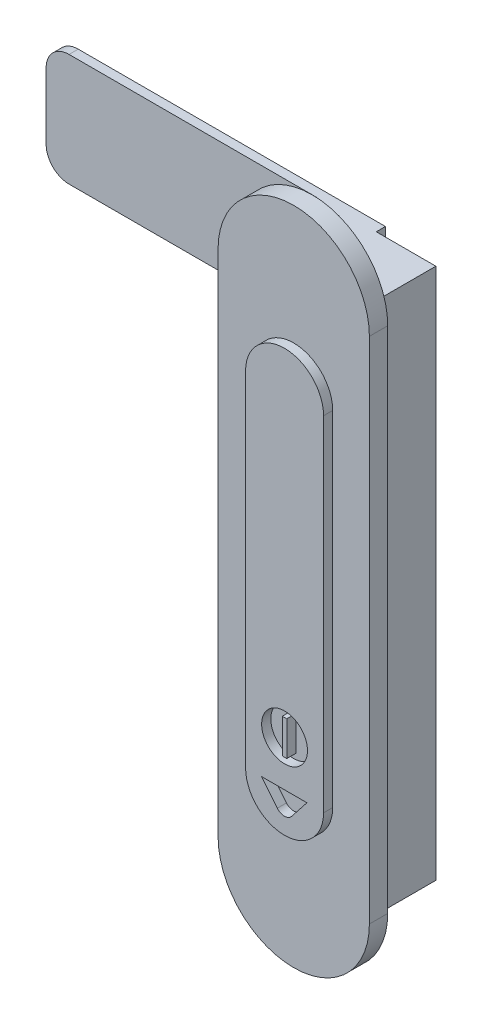
ISO-10303-21;
HEADER;
FILE_DESCRIPTION(('STEP AP214'),'2;1');
FILE_NAME('part.step','',(''),(''),'','','');
FILE_SCHEMA(('AUTOMOTIVE_DESIGN { 1 0 10303 214 1 1 1 1 }'));
ENDSEC;
DATA;
#1=APPLICATION_CONTEXT('core data for automotive mechanical design processes');
#2=APPLICATION_PROTOCOL_DEFINITION('international standard','automotive_design',2000,#1);
#3=PRODUCT_CONTEXT('',#1,'mechanical');
#4=PRODUCT('Part','Part','',(#3));
#5=PRODUCT_RELATED_PRODUCT_CATEGORY('part','',(#4));
#6=PRODUCT_DEFINITION_FORMATION('','',#4);
#7=PRODUCT_DEFINITION_CONTEXT('part definition',#1,'design');
#8=PRODUCT_DEFINITION('design','',#6,#7);
#9=PRODUCT_DEFINITION_SHAPE('','',#8);
#10=(LENGTH_UNIT() NAMED_UNIT(*) SI_UNIT(.MILLI.,.METRE.));
#11=(NAMED_UNIT(*) PLANE_ANGLE_UNIT() SI_UNIT($,.RADIAN.));
#12=(NAMED_UNIT(*) SI_UNIT($,.STERADIAN.) SOLID_ANGLE_UNIT());
#13=UNCERTAINTY_MEASURE_WITH_UNIT(LENGTH_MEASURE(1.E-05),#10,'distance_accuracy_value','');
#14=(GEOMETRIC_REPRESENTATION_CONTEXT(3) GLOBAL_UNCERTAINTY_ASSIGNED_CONTEXT((#13)) GLOBAL_UNIT_ASSIGNED_CONTEXT((#10,
#11,#12)) REPRESENTATION_CONTEXT('',''));
#15=CARTESIAN_POINT('',(0.,0.,0.));
#16=DIRECTION('',(0.,0.,1.));
#17=DIRECTION('',(1.,0.,0.));
#18=AXIS2_PLACEMENT_3D('',#15,#16,#17);
#19=CARTESIAN_POINT('',(0.,0.,-14.));
#20=DIRECTION('',(0.,0.,1.));
#21=DIRECTION('',(1.,0.,0.));
#22=AXIS2_PLACEMENT_3D('',#19,#20,#21);
#23=PLANE('',#22);
#24=DIRECTION('',(0.,-1.,0.));
#25=VECTOR('',#24,1.);
#26=CARTESIAN_POINT('',(0.,58.,-14.));
#27=LINE('',#26,#25);
#28=CARTESIAN_POINT('',(0.,58.,-14.));
#29=VERTEX_POINT('',#28);
#30=CARTESIAN_POINT('',(0.,33.5,-14.));
#31=VERTEX_POINT('',#30);
#32=EDGE_CURVE('E62',#29,#31,#27,.T.);
#33=ORIENTED_EDGE('',*,*,#32,.F.);
#34=DIRECTION('',(1.,0.,0.));
#35=VECTOR('',#34,1.);
#36=CARTESIAN_POINT('',(13.,58.,-14.));
#37=LINE('',#36,#35);
#38=CARTESIAN_POINT('',(13.,58.,-14.));
#39=VERTEX_POINT('',#38);
#40=EDGE_CURVE('E254',#29,#39,#37,.T.);
#41=ORIENTED_EDGE('',*,*,#40,.T.);
#42=DIRECTION('',(0.,-1.,0.));
#43=VECTOR('',#42,1.);
#44=CARTESIAN_POINT('',(13.,-58.,-14.));
#45=LINE('',#44,#43);
#46=CARTESIAN_POINT('',(13.,-58.,-14.));
#47=VERTEX_POINT('',#46);
#48=EDGE_CURVE('E258',#39,#47,#45,.T.);
#49=ORIENTED_EDGE('',*,*,#48,.T.);
#50=DIRECTION('',(-1.,0.,0.));
#51=VECTOR('',#50,1.);
#52=CARTESIAN_POINT('',(13.,-58.,-14.));
#53=LINE('',#52,#51);
#54=CARTESIAN_POINT('',(-13.,-58.,-14.));
#55=VERTEX_POINT('',#54);
#56=EDGE_CURVE('E261',#47,#55,#53,.T.);
#57=ORIENTED_EDGE('',*,*,#56,.T.);
#58=DIRECTION('',(0.,1.,0.));
#59=VECTOR('',#58,1.);
#60=CARTESIAN_POINT('',(-13.,-58.,-14.));
#61=LINE('',#60,#59);
#62=CARTESIAN_POINT('',(-13.,33.5,-14.));
#63=VERTEX_POINT('',#62);
#64=EDGE_CURVE('E251',#55,#63,#61,.T.);
#65=ORIENTED_EDGE('',*,*,#64,.T.);
#66=DIRECTION('',(-1.,0.,0.));
#67=VECTOR('',#66,1.);
#68=CARTESIAN_POINT('',(0.,33.5,-14.));
#69=LINE('',#68,#67);
#70=EDGE_CURVE('E57',#31,#63,#69,.T.);
#71=ORIENTED_EDGE('',*,*,#70,.F.);
#72=EDGE_LOOP('',(#33,#41,#49,#57,#65,#71));
#73=FACE_BOUND('',#72,.T.);
#74=ADVANCED_FACE('F41',(#73),#23,.F.);
#75=CARTESIAN_POINT('',(0.,-55.5,0.));
#76=DIRECTION('',(0.,0.,1.));
#77=DIRECTION('',(1.,0.,0.));
#78=AXIS2_PLACEMENT_3D('',#75,#76,#77);
#79=PLANE('',#78);
#80=CARTESIAN_POINT('',(0.,-55.5,0.));
#81=DIRECTION('',(0.,0.,1.));
#82=DIRECTION('',(1.,0.,0.));
#83=AXIS2_PLACEMENT_3D('',#80,#81,#82);
#84=CIRCLE('',#83,16.5);
#85=CARTESIAN_POINT('',(-16.5,-55.5,0.));
#86=VERTEX_POINT('',#85);
#87=CARTESIAN_POINT('',(16.5,-55.5,0.));
#88=VERTEX_POINT('',#87);
#89=EDGE_CURVE('E414',#86,#88,#84,.T.);
#90=ORIENTED_EDGE('',*,*,#89,.F.);
#91=DIRECTION('',(0.,-1.,0.));
#92=VECTOR('',#91,1.);
#93=CARTESIAN_POINT('',(-16.5,-55.5,0.));
#94=LINE('',#93,#92);
#95=CARTESIAN_POINT('',(-16.5,55.5,0.));
#96=VERTEX_POINT('',#95);
#97=EDGE_CURVE('E420',#96,#86,#94,.T.);
#98=ORIENTED_EDGE('',*,*,#97,.F.);
#99=CARTESIAN_POINT('',(0.,55.5,0.));
#100=DIRECTION('',(0.,0.,1.));
#101=DIRECTION('',(1.,0.,0.));
#102=AXIS2_PLACEMENT_3D('',#99,#100,#101);
#103=CIRCLE('',#102,16.5);
#104=CARTESIAN_POINT('',(16.5,55.5,0.));
#105=VERTEX_POINT('',#104);
#106=EDGE_CURVE('E436',#105,#96,#103,.T.);
#107=ORIENTED_EDGE('',*,*,#106,.F.);
#108=DIRECTION('',(0.,1.,0.));
#109=VECTOR('',#108,1.);
#110=CARTESIAN_POINT('',(16.5,-55.5,0.));
#111=LINE('',#110,#109);
#112=EDGE_CURVE('E433',#88,#105,#111,.T.);
#113=ORIENTED_EDGE('',*,*,#112,.F.);
#114=EDGE_LOOP('',(#90,#98,#107,#113));
#115=FACE_BOUND('',#114,.T.);
#116=DIRECTION('',(0.,1.,0.));
#117=VECTOR('',#116,1.);
#118=CARTESIAN_POINT('',(-13.,-58.,0.));
#119=LINE('',#118,#117);
#120=CARTESIAN_POINT('',(-13.,-58.,0.));
#121=VERTEX_POINT('',#120);
#122=CARTESIAN_POINT('',(-13.,58.,0.));
#123=VERTEX_POINT('',#122);
#124=EDGE_CURVE('E240',#121,#123,#119,.T.);
#125=ORIENTED_EDGE('',*,*,#124,.F.);
#126=DIRECTION('',(-1.,0.,0.));
#127=VECTOR('',#126,1.);
#128=CARTESIAN_POINT('',(13.,-58.,0.));
#129=LINE('',#128,#127);
#130=CARTESIAN_POINT('',(13.,-58.,0.));
#131=VERTEX_POINT('',#130);
#132=EDGE_CURVE('E272',#131,#121,#129,.T.);
#133=ORIENTED_EDGE('',*,*,#132,.F.);
#134=DIRECTION('',(0.,-1.,0.));
#135=VECTOR('',#134,1.);
#136=CARTESIAN_POINT('',(13.,-58.,0.));
#137=LINE('',#136,#135);
#138=CARTESIAN_POINT('',(13.,58.,0.));
#139=VERTEX_POINT('',#138);
#140=EDGE_CURVE('E268',#139,#131,#137,.T.);
#141=ORIENTED_EDGE('',*,*,#140,.F.);
#142=DIRECTION('',(1.,0.,0.));
#143=VECTOR('',#142,1.);
#144=CARTESIAN_POINT('',(13.,58.,0.));
#145=LINE('',#144,#143);
#146=EDGE_CURVE('E245',#123,#139,#145,.T.);
#147=ORIENTED_EDGE('',*,*,#146,.F.);
#148=EDGE_LOOP('',(#125,#133,#141,#147));
#149=FACE_BOUND('',#148,.T.);
#150=ADVANCED_FACE('F496',(#115,#149),#79,.F.);
#151=CARTESIAN_POINT('',(0.,-55.5,4.));
#152=DIRECTION('',(0.,0.,1.));
#153=DIRECTION('',(1.,0.,0.));
#154=AXIS2_PLACEMENT_3D('',#151,#152,#153);
#155=PLANE('',#154);
#156=CARTESIAN_POINT('',(0.,-27.5,4.));
#157=DIRECTION('',(0.,0.,1.));
#158=DIRECTION('',(1.,0.,0.));
#159=AXIS2_PLACEMENT_3D('',#156,#157,#158);
#160=CIRCLE('',#159,5.);
#161=CARTESIAN_POINT('',(5.,-27.5,4.));
#162=VERTEX_POINT('',#161);
#163=EDGE_CURVE('E361',#162,#162,#160,.T.);
#164=ORIENTED_EDGE('',*,*,#163,.T.);
#165=EDGE_LOOP('',(#164));
#166=FACE_BOUND('',#165,.T.);
#167=DIRECTION('',(-1.,0.,0.));
#168=VECTOR('',#167,1.);
#169=CARTESIAN_POINT('',(-0.486395863282293,-23.7440032733761,4.));
#170=LINE('',#169,#168);
#171=CARTESIAN_POINT('',(0.486395863282293,-23.7440032733761,4.));
#172=VERTEX_POINT('',#171);
#173=CARTESIAN_POINT('',(-0.486395863282293,-23.7440032733761,4.));
#174=VERTEX_POINT('',#173);
#175=EDGE_CURVE('E339',#172,#174,#170,.T.);
#176=ORIENTED_EDGE('',*,*,#175,.F.);
#177=DIRECTION('',(0.,1.,0.));
#178=VECTOR('',#177,1.);
#179=CARTESIAN_POINT('',(0.486395863282293,-23.7440032733761,4.));
#180=LINE('',#179,#178);
#181=CARTESIAN_POINT('',(0.486395863282293,-31.2559967266238,4.));
#182=VERTEX_POINT('',#181);
#183=EDGE_CURVE('E317',#182,#172,#180,.T.);
#184=ORIENTED_EDGE('',*,*,#183,.F.);
#185=DIRECTION('',(1.,0.,0.));
#186=VECTOR('',#185,1.);
#187=CARTESIAN_POINT('',(-0.486395863282293,-31.2559967266238,4.));
#188=LINE('',#187,#186);
#189=CARTESIAN_POINT('',(-0.486395863282293,-31.2559967266238,4.));
#190=VERTEX_POINT('',#189);
#191=EDGE_CURVE('E326',#190,#182,#188,.T.);
#192=ORIENTED_EDGE('',*,*,#191,.F.);
#193=DIRECTION('',(0.,-1.,0.));
#194=VECTOR('',#193,1.);
#195=CARTESIAN_POINT('',(-0.486395863282293,-23.7440032733761,4.));
#196=LINE('',#195,#194);
#197=EDGE_CURVE('E342',#174,#190,#196,.T.);
#198=ORIENTED_EDGE('',*,*,#197,.F.);
#199=EDGE_LOOP('',(#176,#184,#192,#198));
#200=FACE_BOUND('',#199,.T.);
#201=ADVANCED_FACE('F501',(#166,#200),#155,.T.);
#202=CARTESIAN_POINT('',(0.,-55.5,4.));
#203=DIRECTION('',(0.,0.,-1.));
#204=DIRECTION('',(-1.,0.,0.));
#205=AXIS2_PLACEMENT_3D('',#202,#203,#204);
#206=CYLINDRICAL_SURFACE('',#205,16.5);
#207=ORIENTED_EDGE('',*,*,#89,.T.);
#208=DIRECTION('',(0.,0.,-1.));
#209=VECTOR('',#208,1.);
#210=CARTESIAN_POINT('',(16.5,-55.5,4.));
#211=LINE('',#210,#209);
#212=CARTESIAN_POINT('',(16.5,-55.5,4.));
#213=VERTEX_POINT('',#212);
#214=EDGE_CURVE('E452',#213,#88,#211,.T.);
#215=ORIENTED_EDGE('',*,*,#214,.F.);
#216=CARTESIAN_POINT('',(0.,-55.5,4.));
#217=DIRECTION('',(0.,0.,1.));
#218=DIRECTION('',(1.,0.,0.));
#219=AXIS2_PLACEMENT_3D('',#216,#217,#218);
#220=CIRCLE('',#219,16.5);
#221=CARTESIAN_POINT('',(-16.5,-55.5,4.));
#222=VERTEX_POINT('',#221);
#223=EDGE_CURVE('E415',#222,#213,#220,.T.);
#224=ORIENTED_EDGE('',*,*,#223,.F.);
#225=DIRECTION('',(0.,0.,-1.));
#226=VECTOR('',#225,1.);
#227=CARTESIAN_POINT('',(-16.5,-55.5,4.));
#228=LINE('',#227,#226);
#229=EDGE_CURVE('E429',#222,#86,#228,.T.);
#230=ORIENTED_EDGE('',*,*,#229,.T.);
#231=EDGE_LOOP('',(#207,#215,#224,#230));
#232=FACE_BOUND('',#231,.T.);
#233=ADVANCED_FACE('F701',(#232),#206,.T.);
#234=CARTESIAN_POINT('',(16.5,-55.5,4.));
#235=DIRECTION('',(-1.,0.,0.));
#236=DIRECTION('',(0.,-1.,0.));
#237=AXIS2_PLACEMENT_3D('',#234,#235,#236);
#238=PLANE('',#237);
#239=ORIENTED_EDGE('',*,*,#112,.T.);
#240=DIRECTION('',(0.,0.,-1.));
#241=VECTOR('',#240,1.);
#242=CARTESIAN_POINT('',(16.5,55.5,4.));
#243=LINE('',#242,#241);
#244=CARTESIAN_POINT('',(16.5,55.5,4.));
#245=VERTEX_POINT('',#244);
#246=EDGE_CURVE('E448',#245,#105,#243,.T.);
#247=ORIENTED_EDGE('',*,*,#246,.F.);
#248=DIRECTION('',(0.,1.,0.));
#249=VECTOR('',#248,1.);
#250=CARTESIAN_POINT('',(16.5,-55.5,4.));
#251=LINE('',#250,#249);
#252=EDGE_CURVE('E419',#213,#245,#251,.T.);
#253=ORIENTED_EDGE('',*,*,#252,.F.);
#254=ORIENTED_EDGE('',*,*,#214,.T.);
#255=EDGE_LOOP('',(#239,#247,#253,#254));
#256=FACE_BOUND('',#255,.T.);
#257=ADVANCED_FACE('F781',(#256),#238,.F.);
#258=CARTESIAN_POINT('',(0.,55.5,4.));
#259=DIRECTION('',(0.,0.,-1.));
#260=DIRECTION('',(-1.,0.,0.));
#261=AXIS2_PLACEMENT_3D('',#258,#259,#260);
#262=CYLINDRICAL_SURFACE('',#261,16.5);
#263=ORIENTED_EDGE('',*,*,#106,.T.);
#264=DIRECTION('',(0.,0.,-1.));
#265=VECTOR('',#264,1.);
#266=CARTESIAN_POINT('',(-16.5,55.5,4.));
#267=LINE('',#266,#265);
#268=CARTESIAN_POINT('',(-16.5,55.5,4.));
#269=VERTEX_POINT('',#268);
#270=EDGE_CURVE('E444',#269,#96,#267,.T.);
#271=ORIENTED_EDGE('',*,*,#270,.F.);
#272=CARTESIAN_POINT('',(0.,55.5,4.));
#273=DIRECTION('',(0.,0.,1.));
#274=DIRECTION('',(1.,0.,0.));
#275=AXIS2_PLACEMENT_3D('',#272,#273,#274);
#276=CIRCLE('',#275,16.5);
#277=EDGE_CURVE('E423',#245,#269,#276,.T.);
#278=ORIENTED_EDGE('',*,*,#277,.F.);
#279=ORIENTED_EDGE('',*,*,#246,.T.);
#280=EDGE_LOOP('',(#263,#271,#278,#279));
#281=FACE_BOUND('',#280,.T.);
#282=ADVANCED_FACE('F771',(#281),#262,.T.);
#283=CARTESIAN_POINT('',(-16.5,-55.5,4.));
#284=DIRECTION('',(1.,0.,0.));
#285=DIRECTION('',(0.,1.,0.));
#286=AXIS2_PLACEMENT_3D('',#283,#284,#285);
#287=PLANE('',#286);
#288=ORIENTED_EDGE('',*,*,#97,.T.);
#289=ORIENTED_EDGE('',*,*,#229,.F.);
#290=DIRECTION('',(0.,-1.,0.));
#291=VECTOR('',#290,1.);
#292=CARTESIAN_POINT('',(-16.5,-55.5,4.));
#293=LINE('',#292,#291);
#294=EDGE_CURVE('E426',#269,#222,#293,.T.);
#295=ORIENTED_EDGE('',*,*,#294,.F.);
#296=ORIENTED_EDGE('',*,*,#270,.T.);
#297=EDGE_LOOP('',(#288,#289,#295,#296));
#298=FACE_BOUND('',#297,.T.);
#299=ADVANCED_FACE('F762',(#298),#287,.F.);
#300=CARTESIAN_POINT('',(0.,-37.5,4.));
#301=DIRECTION('',(0.,0.,1.));
#302=DIRECTION('',(1.,0.,0.));
#303=AXIS2_PLACEMENT_3D('',#300,#301,#302);
#304=CIRCLE('',#303,8.5);
#305=CARTESIAN_POINT('',(-8.5,-37.5,4.));
#306=VERTEX_POINT('',#305);
#307=CARTESIAN_POINT('',(8.5,-37.5,4.));
#308=VERTEX_POINT('',#307);
#309=EDGE_CURVE('E366',#306,#308,#304,.T.);
#310=ORIENTED_EDGE('',*,*,#309,.F.);
#311=DIRECTION('',(0.,-1.,0.));
#312=VECTOR('',#311,1.);
#313=CARTESIAN_POINT('',(-8.5,-37.5,4.));
#314=LINE('',#313,#312);
#315=CARTESIAN_POINT('',(-8.50000000000001,37.5,4.));
#316=VERTEX_POINT('',#315);
#317=EDGE_CURVE('E375',#316,#306,#314,.T.);
#318=ORIENTED_EDGE('',*,*,#317,.F.);
#319=CARTESIAN_POINT('',(0.,37.5,4.));
#320=DIRECTION('',(0.,0.,1.));
#321=DIRECTION('',(1.,0.,0.));
#322=AXIS2_PLACEMENT_3D('',#319,#320,#321);
#323=CIRCLE('',#322,8.5);
#324=CARTESIAN_POINT('',(8.49999999999999,37.5,4.));
#325=VERTEX_POINT('',#324);
#326=EDGE_CURVE('E392',#325,#316,#323,.T.);
#327=ORIENTED_EDGE('',*,*,#326,.F.);
#328=DIRECTION('',(0.,1.,0.));
#329=VECTOR('',#328,1.);
#330=CARTESIAN_POINT('',(8.5,-37.5,4.));
#331=LINE('',#330,#329);
#332=EDGE_CURVE('E388',#308,#325,#331,.T.);
#333=ORIENTED_EDGE('',*,*,#332,.F.);
#334=EDGE_LOOP('',(#310,#318,#327,#333));
#335=FACE_BOUND('',#334,.T.);
#336=ORIENTED_EDGE('',*,*,#223,.T.);
#337=ORIENTED_EDGE('',*,*,#252,.T.);
#338=ORIENTED_EDGE('',*,*,#277,.T.);
#339=ORIENTED_EDGE('',*,*,#294,.T.);
#340=EDGE_LOOP('',(#336,#337,#338,#339));
#341=FACE_BOUND('',#340,.T.);
#342=ADVANCED_FACE('F704',(#335,#341),#155,.T.);
#343=CARTESIAN_POINT('',(0.,-37.5,6.));
#344=DIRECTION('',(0.,0.,1.));
#345=DIRECTION('',(1.,0.,0.));
#346=AXIS2_PLACEMENT_3D('',#343,#344,#345);
#347=PLANE('',#346);
#348=DIRECTION('',(0.627156226491103,-0.778893489235493,0.));
#349=VECTOR('',#348,1.);
#350=CARTESIAN_POINT('',(-5.,-37.4040947438061,6.));
#351=LINE('',#350,#349);
#352=CARTESIAN_POINT('',(-5.,-37.4040947438061,6.));
#353=VERTEX_POINT('',#352);
#354=CARTESIAN_POINT('',(-1.57688687007832,-41.655412704452,6.));
#355=VERTEX_POINT('',#354);
#356=EDGE_CURVE('E291',#353,#355,#351,.T.);
#357=ORIENTED_EDGE('',*,*,#356,.F.);
#358=DIRECTION('',(-1.,0.,0.));
#359=VECTOR('',#358,1.);
#360=CARTESIAN_POINT('',(4.87944604689717,-37.4040947438061,6.));
#361=LINE('',#360,#359);
#362=CARTESIAN_POINT('',(4.87944604689717,-37.4040947438061,6.));
#363=VERTEX_POINT('',#362);
#364=EDGE_CURVE('E297',#363,#353,#361,.T.);
#365=ORIENTED_EDGE('',*,*,#364,.F.);
#366=DIRECTION('',(0.617851045179688,0.786295164661698,0.));
#367=VECTOR('',#366,1.);
#368=CARTESIAN_POINT('',(0.,-43.6138193414024,6.));
#369=LINE('',#368,#367);
#370=CARTESIAN_POINT('',(1.55349043771606,-41.6368023418292,6.));
#371=VERTEX_POINT('',#370);
#372=EDGE_CURVE('E308',#371,#363,#369,.T.);
#373=ORIENTED_EDGE('',*,*,#372,.F.);
#374=CARTESIAN_POINT('',(-0.0190998916073336,-40.4011002514698,6.));
#375=DIRECTION('',(0.,0.,1.));
#376=DIRECTION('',(1.,0.,0.));
#377=AXIS2_PLACEMENT_3D('',#374,#375,#376);
#378=CIRCLE('',#377,2.);
#379=EDGE_CURVE('E11',#371,#355,#378,.F.);
#380=ORIENTED_EDGE('',*,*,#379,.T.);
#381=EDGE_LOOP('',(#357,#365,#373,#380));
#382=FACE_BOUND('',#381,.T.);
#383=CARTESIAN_POINT('',(0.,-37.5,6.));
#384=DIRECTION('',(0.,0.,1.));
#385=DIRECTION('',(1.,0.,0.));
#386=AXIS2_PLACEMENT_3D('',#383,#384,#385);
#387=CIRCLE('',#386,8.5);
#388=CARTESIAN_POINT('',(-8.5,-37.5,6.));
#389=VERTEX_POINT('',#388);
#390=CARTESIAN_POINT('',(8.5,-37.5,6.));
#391=VERTEX_POINT('',#390);
#392=EDGE_CURVE('E370',#389,#391,#387,.T.);
#393=ORIENTED_EDGE('',*,*,#392,.T.);
#394=DIRECTION('',(0.,1.,0.));
#395=VECTOR('',#394,1.);
#396=CARTESIAN_POINT('',(8.5,-37.5,6.));
#397=LINE('',#396,#395);
#398=CARTESIAN_POINT('',(8.49999999999999,37.5,6.));
#399=VERTEX_POINT('',#398);
#400=EDGE_CURVE('E374',#391,#399,#397,.T.);
#401=ORIENTED_EDGE('',*,*,#400,.T.);
#402=CARTESIAN_POINT('',(0.,37.5,6.));
#403=DIRECTION('',(0.,0.,1.));
#404=DIRECTION('',(1.,0.,0.));
#405=AXIS2_PLACEMENT_3D('',#402,#403,#404);
#406=CIRCLE('',#405,8.5);
#407=CARTESIAN_POINT('',(-8.50000000000001,37.5,6.));
#408=VERTEX_POINT('',#407);
#409=EDGE_CURVE('E378',#399,#408,#406,.T.);
#410=ORIENTED_EDGE('',*,*,#409,.T.);
#411=DIRECTION('',(0.,-1.,0.));
#412=VECTOR('',#411,1.);
#413=CARTESIAN_POINT('',(-8.5,-37.5,6.));
#414=LINE('',#413,#412);
#415=EDGE_CURVE('E381',#408,#389,#414,.T.);
#416=ORIENTED_EDGE('',*,*,#415,.T.);
#417=EDGE_LOOP('',(#393,#401,#410,#416));
#418=FACE_BOUND('',#417,.T.);
#419=CARTESIAN_POINT('',(0.,-27.5,6.));
#420=DIRECTION('',(0.,0.,1.));
#421=DIRECTION('',(1.,0.,0.));
#422=AXIS2_PLACEMENT_3D('',#419,#420,#421);
#423=CIRCLE('',#422,5.);
#424=CARTESIAN_POINT('',(5.,-27.5,6.));
#425=VERTEX_POINT('',#424);
#426=EDGE_CURVE('E362',#425,#425,#423,.T.);
#427=ORIENTED_EDGE('',*,*,#426,.F.);
#428=EDGE_LOOP('',(#427));
#429=FACE_BOUND('',#428,.T.);
#430=ADVANCED_FACE('F478',(#382,#418,#429),#347,.T.);
#431=CARTESIAN_POINT('',(0.,-37.5,6.));
#432=DIRECTION('',(0.,0.,-1.));
#433=DIRECTION('',(-1.,0.,0.));
#434=AXIS2_PLACEMENT_3D('',#431,#432,#433);
#435=CYLINDRICAL_SURFACE('',#434,8.5);
#436=ORIENTED_EDGE('',*,*,#309,.T.);
#437=DIRECTION('',(0.,0.,-1.));
#438=VECTOR('',#437,1.);
#439=CARTESIAN_POINT('',(8.5,-37.5,6.));
#440=LINE('',#439,#438);
#441=EDGE_CURVE('E410',#391,#308,#440,.T.);
#442=ORIENTED_EDGE('',*,*,#441,.F.);
#443=ORIENTED_EDGE('',*,*,#392,.F.);
#444=DIRECTION('',(0.,0.,-1.));
#445=VECTOR('',#444,1.);
#446=CARTESIAN_POINT('',(-8.5,-37.5,6.));
#447=LINE('',#446,#445);
#448=EDGE_CURVE('E384',#389,#306,#447,.T.);
#449=ORIENTED_EDGE('',*,*,#448,.T.);
#450=EDGE_LOOP('',(#436,#442,#443,#449));
#451=FACE_BOUND('',#450,.T.);
#452=ADVANCED_FACE('F739',(#451),#435,.T.);
#453=CARTESIAN_POINT('',(8.5,-37.5,6.));
#454=DIRECTION('',(-1.,0.,0.));
#455=DIRECTION('',(0.,-1.,0.));
#456=AXIS2_PLACEMENT_3D('',#453,#454,#455);
#457=PLANE('',#456);
#458=ORIENTED_EDGE('',*,*,#332,.T.);
#459=DIRECTION('',(0.,0.,-1.));
#460=VECTOR('',#459,1.);
#461=CARTESIAN_POINT('',(8.49999999999999,37.5,6.));
#462=LINE('',#461,#460);
#463=EDGE_CURVE('E406',#399,#325,#462,.T.);
#464=ORIENTED_EDGE('',*,*,#463,.F.);
#465=ORIENTED_EDGE('',*,*,#400,.F.);
#466=ORIENTED_EDGE('',*,*,#441,.T.);
#467=EDGE_LOOP('',(#458,#464,#465,#466));
#468=FACE_BOUND('',#467,.T.);
#469=ADVANCED_FACE('F730',(#468),#457,.F.);
#470=CARTESIAN_POINT('',(0.,37.5,6.));
#471=DIRECTION('',(0.,0.,-1.));
#472=DIRECTION('',(-1.,0.,0.));
#473=AXIS2_PLACEMENT_3D('',#470,#471,#472);
#474=CYLINDRICAL_SURFACE('',#473,8.5);
#475=ORIENTED_EDGE('',*,*,#326,.T.);
#476=DIRECTION('',(0.,0.,-1.));
#477=VECTOR('',#476,1.);
#478=CARTESIAN_POINT('',(-8.50000000000001,37.5,6.));
#479=LINE('',#478,#477);
#480=EDGE_CURVE('E402',#408,#316,#479,.T.);
#481=ORIENTED_EDGE('',*,*,#480,.F.);
#482=ORIENTED_EDGE('',*,*,#409,.F.);
#483=ORIENTED_EDGE('',*,*,#463,.T.);
#484=EDGE_LOOP('',(#475,#481,#482,#483));
#485=FACE_BOUND('',#484,.T.);
#486=ADVANCED_FACE('F721',(#485),#474,.T.);
#487=CARTESIAN_POINT('',(-8.5,-37.5,6.));
#488=DIRECTION('',(1.,0.,0.));
#489=DIRECTION('',(0.,1.,0.));
#490=AXIS2_PLACEMENT_3D('',#487,#488,#489);
#491=PLANE('',#490);
#492=ORIENTED_EDGE('',*,*,#317,.T.);
#493=ORIENTED_EDGE('',*,*,#448,.F.);
#494=ORIENTED_EDGE('',*,*,#415,.F.);
#495=ORIENTED_EDGE('',*,*,#480,.T.);
#496=EDGE_LOOP('',(#492,#493,#494,#495));
#497=FACE_BOUND('',#496,.T.);
#498=ADVANCED_FACE('F712',(#497),#491,.F.);
#499=CARTESIAN_POINT('',(0.,-27.5,6.));
#500=DIRECTION('',(0.,0.,-1.));
#501=DIRECTION('',(-1.,0.,0.));
#502=AXIS2_PLACEMENT_3D('',#499,#500,#501);
#503=CYLINDRICAL_SURFACE('',#502,5.);
#504=ORIENTED_EDGE('',*,*,#426,.T.);
#505=EDGE_LOOP('',(#504));
#506=FACE_BOUND('',#505,.T.);
#507=ORIENTED_EDGE('',*,*,#163,.F.);
#508=EDGE_LOOP('',(#507));
#509=FACE_BOUND('',#508,.T.);
#510=ADVANCED_FACE('F692',(#506,#509),#503,.F.);
#511=CARTESIAN_POINT('',(0.486395863282293,-23.7440032733761,6.));
#512=DIRECTION('',(-1.,0.,0.));
#513=DIRECTION('',(0.,0.,1.));
#514=AXIS2_PLACEMENT_3D('',#511,#512,#513);
#515=PLANE('',#514);
#516=ORIENTED_EDGE('',*,*,#183,.T.);
#517=DIRECTION('',(0.,0.,-1.));
#518=VECTOR('',#517,1.);
#519=CARTESIAN_POINT('',(0.486395863282293,-23.7440032733761,6.));
#520=LINE('',#519,#518);
#521=CARTESIAN_POINT('',(0.486395863282293,-23.7440032733761,6.));
#522=VERTEX_POINT('',#521);
#523=EDGE_CURVE('E358',#522,#172,#520,.T.);
#524=ORIENTED_EDGE('',*,*,#523,.F.);
#525=DIRECTION('',(0.,1.,0.));
#526=VECTOR('',#525,1.);
#527=CARTESIAN_POINT('',(0.486395863282293,-23.7440032733761,6.));
#528=LINE('',#527,#526);
#529=CARTESIAN_POINT('',(0.486395863282293,-31.2559967266238,6.));
#530=VERTEX_POINT('',#529);
#531=EDGE_CURVE('E321',#530,#522,#528,.T.);
#532=ORIENTED_EDGE('',*,*,#531,.F.);
#533=DIRECTION('',(0.,0.,-1.));
#534=VECTOR('',#533,1.);
#535=CARTESIAN_POINT('',(0.486395863282293,-31.2559967266238,6.));
#536=LINE('',#535,#534);
#537=EDGE_CURVE('E335',#530,#182,#536,.T.);
#538=ORIENTED_EDGE('',*,*,#537,.T.);
#539=EDGE_LOOP('',(#516,#524,#532,#538));
#540=FACE_BOUND('',#539,.T.);
#541=ADVANCED_FACE('F683',(#540),#515,.F.);
#542=CARTESIAN_POINT('',(-0.486395863282293,-23.7440032733761,6.));
#543=DIRECTION('',(0.,-1.,0.));
#544=DIRECTION('',(0.,0.,-1.));
#545=AXIS2_PLACEMENT_3D('',#542,#543,#544);
#546=PLANE('',#545);
#547=ORIENTED_EDGE('',*,*,#175,.T.);
#548=DIRECTION('',(0.,0.,-1.));
#549=VECTOR('',#548,1.);
#550=CARTESIAN_POINT('',(-0.486395863282293,-23.7440032733761,6.));
#551=LINE('',#550,#549);
#552=CARTESIAN_POINT('',(-0.486395863282293,-23.7440032733761,6.));
#553=VERTEX_POINT('',#552);
#554=EDGE_CURVE('E354',#553,#174,#551,.T.);
#555=ORIENTED_EDGE('',*,*,#554,.F.);
#556=DIRECTION('',(-1.,0.,0.));
#557=VECTOR('',#556,1.);
#558=CARTESIAN_POINT('',(-0.486395863282293,-23.7440032733761,6.));
#559=LINE('',#558,#557);
#560=EDGE_CURVE('E325',#522,#553,#559,.T.);
#561=ORIENTED_EDGE('',*,*,#560,.F.);
#562=ORIENTED_EDGE('',*,*,#523,.T.);
#563=EDGE_LOOP('',(#547,#555,#561,#562));
#564=FACE_BOUND('',#563,.T.);
#565=ADVANCED_FACE('F674',(#564),#546,.F.);
#566=CARTESIAN_POINT('',(-0.486395863282293,-23.7440032733761,6.));
#567=DIRECTION('',(1.,0.,0.));
#568=DIRECTION('',(0.,0.,-1.));
#569=AXIS2_PLACEMENT_3D('',#566,#567,#568);
#570=PLANE('',#569);
#571=ORIENTED_EDGE('',*,*,#197,.T.);
#572=DIRECTION('',(0.,0.,-1.));
#573=VECTOR('',#572,1.);
#574=CARTESIAN_POINT('',(-0.486395863282293,-31.2559967266238,6.));
#575=LINE('',#574,#573);
#576=CARTESIAN_POINT('',(-0.486395863282293,-31.2559967266238,6.));
#577=VERTEX_POINT('',#576);
#578=EDGE_CURVE('E351',#577,#190,#575,.T.);
#579=ORIENTED_EDGE('',*,*,#578,.F.);
#580=DIRECTION('',(0.,-1.,0.));
#581=VECTOR('',#580,1.);
#582=CARTESIAN_POINT('',(-0.486395863282293,-23.7440032733761,6.));
#583=LINE('',#582,#581);
#584=EDGE_CURVE('E329',#553,#577,#583,.T.);
#585=ORIENTED_EDGE('',*,*,#584,.F.);
#586=ORIENTED_EDGE('',*,*,#554,.T.);
#587=EDGE_LOOP('',(#571,#579,#585,#586));
#588=FACE_BOUND('',#587,.T.);
#589=ADVANCED_FACE('F665',(#588),#570,.F.);
#590=CARTESIAN_POINT('',(-0.486395863282293,-31.2559967266238,6.));
#591=DIRECTION('',(0.,1.,0.));
#592=DIRECTION('',(0.,0.,1.));
#593=AXIS2_PLACEMENT_3D('',#590,#591,#592);
#594=PLANE('',#593);
#595=ORIENTED_EDGE('',*,*,#191,.T.);
#596=ORIENTED_EDGE('',*,*,#537,.F.);
#597=DIRECTION('',(1.,0.,0.));
#598=VECTOR('',#597,1.);
#599=CARTESIAN_POINT('',(-0.486395863282293,-31.2559967266238,6.));
#600=LINE('',#599,#598);
#601=EDGE_CURVE('E332',#577,#530,#600,.T.);
#602=ORIENTED_EDGE('',*,*,#601,.F.);
#603=ORIENTED_EDGE('',*,*,#578,.T.);
#604=EDGE_LOOP('',(#595,#596,#602,#603));
#605=FACE_BOUND('',#604,.T.);
#606=ADVANCED_FACE('F656',(#605),#594,.F.);
#607=CARTESIAN_POINT('',(0.,0.,6.));
#608=DIRECTION('',(0.,0.,1.));
#609=DIRECTION('',(1.,0.,0.));
#610=AXIS2_PLACEMENT_3D('',#607,#608,#609);
#611=PLANE('',#610);
#612=ORIENTED_EDGE('',*,*,#531,.T.);
#613=ORIENTED_EDGE('',*,*,#560,.T.);
#614=ORIENTED_EDGE('',*,*,#584,.T.);
#615=ORIENTED_EDGE('',*,*,#601,.T.);
#616=EDGE_LOOP('',(#612,#613,#614,#615));
#617=FACE_BOUND('',#616,.T.);
#618=ADVANCED_FACE('F492',(#617),#611,.T.);
#619=CARTESIAN_POINT('',(-5.,-37.4040947438061,4.));
#620=DIRECTION('',(-0.778893489235493,-0.627156226491103,0.));
#621=DIRECTION('',(0.627156226491103,-0.778893489235493,0.));
#622=AXIS2_PLACEMENT_3D('',#619,#620,#621);
#623=PLANE('',#622);
#624=ORIENTED_EDGE('',*,*,#356,.T.);
#625=DIRECTION('',(0.,0.,1.));
#626=VECTOR('',#625,1.);
#627=CARTESIAN_POINT('',(-1.57688687007832,-41.655412704452,4.));
#628=LINE('',#627,#626);
#629=CARTESIAN_POINT('',(-1.57688687007832,-41.655412704452,4.));
#630=VERTEX_POINT('',#629);
#631=EDGE_CURVE('E460',#355,#630,#628,.F.);
#632=ORIENTED_EDGE('',*,*,#631,.T.);
#633=DIRECTION('',(0.627156226491103,-0.778893489235493,0.));
#634=VECTOR('',#633,1.);
#635=CARTESIAN_POINT('',(-5.,-37.4040947438061,4.));
#636=LINE('',#635,#634);
#637=CARTESIAN_POINT('',(-5.,-37.4040947438061,4.));
#638=VERTEX_POINT('',#637);
#639=EDGE_CURVE('E292',#638,#630,#636,.T.);
#640=ORIENTED_EDGE('',*,*,#639,.F.);
#641=DIRECTION('',(0.,0.,1.));
#642=VECTOR('',#641,1.);
#643=CARTESIAN_POINT('',(-5.,-37.4040947438061,4.));
#644=LINE('',#643,#642);
#645=EDGE_CURVE('E314',#638,#353,#644,.T.);
#646=ORIENTED_EDGE('',*,*,#645,.T.);
#647=EDGE_LOOP('',(#624,#632,#640,#646));
#648=FACE_BOUND('',#647,.T.);
#649=ADVANCED_FACE('F482',(#648),#623,.F.);
#650=CARTESIAN_POINT('',(4.87944604689717,-37.4040947438061,4.));
#651=DIRECTION('',(0.,1.,0.));
#652=DIRECTION('',(0.,0.,1.));
#653=AXIS2_PLACEMENT_3D('',#650,#651,#652);
#654=PLANE('',#653);
#655=ORIENTED_EDGE('',*,*,#364,.T.);
#656=ORIENTED_EDGE('',*,*,#645,.F.);
#657=DIRECTION('',(-1.,0.,0.));
#658=VECTOR('',#657,1.);
#659=CARTESIAN_POINT('',(4.87944604689717,-37.4040947438061,4.));
#660=LINE('',#659,#658);
#661=CARTESIAN_POINT('',(4.87944604689717,-37.4040947438061,4.));
#662=VERTEX_POINT('',#661);
#663=EDGE_CURVE('E300',#662,#638,#660,.T.);
#664=ORIENTED_EDGE('',*,*,#663,.F.);
#665=DIRECTION('',(0.,0.,1.));
#666=VECTOR('',#665,1.);
#667=CARTESIAN_POINT('',(4.87944604689717,-37.4040947438061,4.));
#668=LINE('',#667,#666);
#669=EDGE_CURVE('E304',#662,#363,#668,.T.);
#670=ORIENTED_EDGE('',*,*,#669,.T.);
#671=EDGE_LOOP('',(#655,#656,#664,#670));
#672=FACE_BOUND('',#671,.T.);
#673=ADVANCED_FACE('F484',(#672),#654,.F.);
#674=CARTESIAN_POINT('',(0.,-43.6138193414024,4.));
#675=DIRECTION('',(0.786295164661698,-0.617851045179689,0.));
#676=DIRECTION('',(0.617851045179689,0.786295164661698,0.));
#677=AXIS2_PLACEMENT_3D('',#674,#675,#676);
#678=PLANE('',#677);
#679=DIRECTION('',(0.617851045179688,0.786295164661698,0.));
#680=VECTOR('',#679,1.);
#681=CARTESIAN_POINT('',(0.,-43.6138193414024,4.));
#682=LINE('',#681,#680);
#683=CARTESIAN_POINT('',(1.55349043771606,-41.6368023418292,4.));
#684=VERTEX_POINT('',#683);
#685=EDGE_CURVE('E296',#684,#662,#682,.T.);
#686=ORIENTED_EDGE('',*,*,#685,.F.);
#687=DIRECTION('',(0.,0.,1.));
#688=VECTOR('',#687,1.);
#689=CARTESIAN_POINT('',(1.55349043771606,-41.6368023418292,6.));
#690=LINE('',#689,#688);
#691=EDGE_CURVE('E456',#684,#371,#690,.T.);
#692=ORIENTED_EDGE('',*,*,#691,.T.);
#693=ORIENTED_EDGE('',*,*,#372,.T.);
#694=ORIENTED_EDGE('',*,*,#669,.F.);
#695=EDGE_LOOP('',(#686,#692,#693,#694));
#696=FACE_BOUND('',#695,.T.);
#697=ADVANCED_FACE('F473',(#696),#678,.F.);
#698=CARTESIAN_POINT('',(0.,0.,4.));
#699=DIRECTION('',(0.,0.,1.));
#700=DIRECTION('',(1.,0.,0.));
#701=AXIS2_PLACEMENT_3D('',#698,#699,#700);
#702=PLANE('',#701);
#703=ORIENTED_EDGE('',*,*,#639,.T.);
#704=CARTESIAN_POINT('',(-0.0190998916073336,-40.4011002514698,4.));
#705=DIRECTION('',(0.,0.,1.));
#706=DIRECTION('',(1.,0.,0.));
#707=AXIS2_PLACEMENT_3D('',#704,#705,#706);
#708=CIRCLE('',#707,2.);
#709=EDGE_CURVE('E50',#630,#684,#708,.T.);
#710=ORIENTED_EDGE('',*,*,#709,.T.);
#711=ORIENTED_EDGE('',*,*,#685,.T.);
#712=ORIENTED_EDGE('',*,*,#663,.T.);
#713=EDGE_LOOP('',(#703,#710,#711,#712));
#714=FACE_BOUND('',#713,.T.);
#715=ADVANCED_FACE('F466',(#714),#702,.T.);
#716=CARTESIAN_POINT('',(-0.0190998916073336,-40.4011002514698,4.));
#717=DIRECTION('',(0.,0.,-1.));
#718=DIRECTION('',(-1.,0.,0.));
#719=AXIS2_PLACEMENT_3D('',#716,#717,#718);
#720=CYLINDRICAL_SURFACE('',#719,2.);
#721=ORIENTED_EDGE('',*,*,#709,.F.);
#722=ORIENTED_EDGE('',*,*,#631,.F.);
#723=ORIENTED_EDGE('',*,*,#379,.F.);
#724=ORIENTED_EDGE('',*,*,#691,.F.);
#725=EDGE_LOOP('',(#721,#722,#723,#724));
#726=FACE_BOUND('',#725,.T.);
#727=ADVANCED_FACE('F43',(#726),#720,.F.);
#728=CARTESIAN_POINT('',(-13.,-58.,-14.));
#729=DIRECTION('',(1.,0.,0.));
#730=DIRECTION('',(0.,0.,-1.));
#731=AXIS2_PLACEMENT_3D('',#728,#729,#730);
#732=PLANE('',#731);
#733=ORIENTED_EDGE('',*,*,#124,.T.);
#734=DIRECTION('',(0.,0.,1.));
#735=VECTOR('',#734,1.);
#736=CARTESIAN_POINT('',(-13.,58.,-14.));
#737=LINE('',#736,#735);
#738=CARTESIAN_POINT('',(-13.,58.,-14.));
#739=VERTEX_POINT('',#738);
#740=EDGE_CURVE('E287',#739,#123,#737,.T.);
#741=ORIENTED_EDGE('',*,*,#740,.F.);
#742=EDGE_CURVE('E255',#63,#739,#61,.T.);
#743=ORIENTED_EDGE('',*,*,#742,.F.);
#744=ORIENTED_EDGE('',*,*,#64,.F.);
#745=DIRECTION('',(0.,0.,1.));
#746=VECTOR('',#745,1.);
#747=CARTESIAN_POINT('',(-13.,-58.,-14.));
#748=LINE('',#747,#746);
#749=EDGE_CURVE('E263',#55,#121,#748,.T.);
#750=ORIENTED_EDGE('',*,*,#749,.T.);
#751=EDGE_LOOP('',(#733,#741,#743,#744,#750));
#752=FACE_BOUND('',#751,.T.);
#753=ADVANCED_FACE('F519',(#752),#732,.F.);
#754=CARTESIAN_POINT('',(13.,58.,-14.));
#755=DIRECTION('',(0.,-1.,0.));
#756=DIRECTION('',(0.,0.,-1.));
#757=AXIS2_PLACEMENT_3D('',#754,#755,#756);
#758=PLANE('',#757);
#759=ORIENTED_EDGE('',*,*,#146,.T.);
#760=DIRECTION('',(0.,0.,1.));
#761=VECTOR('',#760,1.);
#762=CARTESIAN_POINT('',(13.,58.,-14.));
#763=LINE('',#762,#761);
#764=EDGE_CURVE('E283',#39,#139,#763,.T.);
#765=ORIENTED_EDGE('',*,*,#764,.F.);
#766=ORIENTED_EDGE('',*,*,#40,.F.);
#767=DIRECTION('',(0.,0.,1.));
#768=VECTOR('',#767,1.);
#769=CARTESIAN_POINT('',(0.,58.,-16.));
#770=LINE('',#769,#768);
#771=CARTESIAN_POINT('',(0.,58.,-16.));
#772=VERTEX_POINT('',#771);
#773=EDGE_CURVE('E867',#772,#29,#770,.T.);
#774=ORIENTED_EDGE('',*,*,#773,.F.);
#775=DIRECTION('',(1.,0.,0.));
#776=VECTOR('',#775,1.);
#777=CARTESIAN_POINT('',(0.,58.,-16.));
#778=LINE('',#777,#776);
#779=CARTESIAN_POINT('',(-66.9999999999999,58.,-16.));
#780=VERTEX_POINT('',#779);
#781=EDGE_CURVE('E231',#780,#772,#778,.T.);
#782=ORIENTED_EDGE('',*,*,#781,.F.);
#783=DIRECTION('',(0.,0.,1.));
#784=VECTOR('',#783,1.);
#785=CARTESIAN_POINT('',(-66.9999999999999,58.,-16.));
#786=LINE('',#785,#784);
#787=CARTESIAN_POINT('',(-66.9999999999999,58.,-14.));
#788=VERTEX_POINT('',#787);
#789=EDGE_CURVE('E870',#780,#788,#786,.T.);
#790=ORIENTED_EDGE('',*,*,#789,.T.);
#791=DIRECTION('',(1.,0.,0.));
#792=VECTOR('',#791,1.);
#793=CARTESIAN_POINT('',(0.,58.,-14.));
#794=LINE('',#793,#792);
#795=EDGE_CURVE('E236',#788,#739,#794,.T.);
#796=ORIENTED_EDGE('',*,*,#795,.T.);
#797=ORIENTED_EDGE('',*,*,#740,.T.);
#798=EDGE_LOOP('',(#759,#765,#766,#774,#782,#790,#796,#797));
#799=FACE_BOUND('',#798,.T.);
#800=ADVANCED_FACE('F515',(#799),#758,.F.);
#801=CARTESIAN_POINT('',(13.,-58.,-14.));
#802=DIRECTION('',(-1.,0.,0.));
#803=DIRECTION('',(0.,0.,1.));
#804=AXIS2_PLACEMENT_3D('',#801,#802,#803);
#805=PLANE('',#804);
#806=ORIENTED_EDGE('',*,*,#140,.T.);
#807=DIRECTION('',(0.,0.,1.));
#808=VECTOR('',#807,1.);
#809=CARTESIAN_POINT('',(13.,-58.,-14.));
#810=LINE('',#809,#808);
#811=EDGE_CURVE('E279',#47,#131,#810,.T.);
#812=ORIENTED_EDGE('',*,*,#811,.F.);
#813=ORIENTED_EDGE('',*,*,#48,.F.);
#814=ORIENTED_EDGE('',*,*,#764,.T.);
#815=EDGE_LOOP('',(#806,#812,#813,#814));
#816=FACE_BOUND('',#815,.T.);
#817=ADVANCED_FACE('F511',(#816),#805,.F.);
#818=CARTESIAN_POINT('',(13.,-58.,-14.));
#819=DIRECTION('',(0.,1.,0.));
#820=DIRECTION('',(0.,0.,1.));
#821=AXIS2_PLACEMENT_3D('',#818,#819,#820);
#822=PLANE('',#821);
#823=ORIENTED_EDGE('',*,*,#132,.T.);
#824=ORIENTED_EDGE('',*,*,#749,.F.);
#825=ORIENTED_EDGE('',*,*,#56,.F.);
#826=ORIENTED_EDGE('',*,*,#811,.T.);
#827=EDGE_LOOP('',(#823,#824,#825,#826));
#828=FACE_BOUND('',#827,.T.);
#829=ADVANCED_FACE('F507',(#828),#822,.F.);
#830=CARTESIAN_POINT('',(-67.,38.5,-14.));
#831=DIRECTION('',(0.,0.,-1.));
#832=DIRECTION('',(-1.,0.,0.));
#833=AXIS2_PLACEMENT_3D('',#830,#831,#832);
#834=PLANE('',#833);
#835=CARTESIAN_POINT('',(-67.,33.5,-14.));
#836=VERTEX_POINT('',#835);
#837=EDGE_CURVE('E847',#63,#836,#69,.T.);
#838=ORIENTED_EDGE('',*,*,#837,.F.);
#839=ORIENTED_EDGE('',*,*,#742,.T.);
#840=ORIENTED_EDGE('',*,*,#795,.F.);
#841=CARTESIAN_POINT('',(-67.,53.,-14.));
#842=DIRECTION('',(0.,0.,-1.));
#843=DIRECTION('',(-1.,0.,0.));
#844=AXIS2_PLACEMENT_3D('',#841,#842,#843);
#845=CIRCLE('',#844,4.99999999999999);
#846=CARTESIAN_POINT('',(-72.,53.,-14.));
#847=VERTEX_POINT('',#846);
#848=EDGE_CURVE('E862',#847,#788,#845,.T.);
#849=ORIENTED_EDGE('',*,*,#848,.F.);
#850=DIRECTION('',(0.,1.,0.));
#851=VECTOR('',#850,1.);
#852=CARTESIAN_POINT('',(-72.,53.,-14.));
#853=LINE('',#852,#851);
#854=CARTESIAN_POINT('',(-72.,38.5,-14.));
#855=VERTEX_POINT('',#854);
#856=EDGE_CURVE('E855',#855,#847,#853,.T.);
#857=ORIENTED_EDGE('',*,*,#856,.F.);
#858=CARTESIAN_POINT('',(-67.,38.5,-14.));
#859=DIRECTION('',(0.,0.,-1.));
#860=DIRECTION('',(-1.,0.,0.));
#861=AXIS2_PLACEMENT_3D('',#858,#859,#860);
#862=CIRCLE('',#861,5.);
#863=EDGE_CURVE('E850',#836,#855,#862,.T.);
#864=ORIENTED_EDGE('',*,*,#863,.F.);
#865=EDGE_LOOP('',(#838,#839,#840,#849,#857,#864));
#866=FACE_BOUND('',#865,.T.);
#867=ADVANCED_FACE('F510',(#866),#834,.F.);
#868=CARTESIAN_POINT('',(0.,58.,-16.));
#869=DIRECTION('',(-1.,0.,0.));
#870=DIRECTION('',(0.,-1.,0.));
#871=AXIS2_PLACEMENT_3D('',#868,#869,#870);
#872=PLANE('',#871);
#873=ORIENTED_EDGE('',*,*,#32,.T.);
#874=DIRECTION('',(0.,0.,1.));
#875=VECTOR('',#874,1.);
#876=CARTESIAN_POINT('',(0.,33.5,-16.));
#877=LINE('',#876,#875);
#878=CARTESIAN_POINT('',(0.,33.5,-16.));
#879=VERTEX_POINT('',#878);
#880=EDGE_CURVE('E219',#879,#31,#877,.T.);
#881=ORIENTED_EDGE('',*,*,#880,.F.);
#882=DIRECTION('',(0.,-1.,0.));
#883=VECTOR('',#882,1.);
#884=CARTESIAN_POINT('',(0.,58.,-16.));
#885=LINE('',#884,#883);
#886=EDGE_CURVE('E226',#772,#879,#885,.T.);
#887=ORIENTED_EDGE('',*,*,#886,.F.);
#888=ORIENTED_EDGE('',*,*,#773,.T.);
#889=EDGE_LOOP('',(#873,#881,#887,#888));
#890=FACE_BOUND('',#889,.T.);
#891=ADVANCED_FACE('F238',(#890),#872,.F.);
#892=CARTESIAN_POINT('',(0.,33.5,-16.));
#893=DIRECTION('',(0.,1.,0.));
#894=DIRECTION('',(0.,0.,1.));
#895=AXIS2_PLACEMENT_3D('',#892,#893,#894);
#896=PLANE('',#895);
#897=ORIENTED_EDGE('',*,*,#70,.T.);
#898=ORIENTED_EDGE('',*,*,#837,.T.);
#899=DIRECTION('',(0.,0.,1.));
#900=VECTOR('',#899,1.);
#901=CARTESIAN_POINT('',(-67.,33.5,-16.));
#902=LINE('',#901,#900);
#903=CARTESIAN_POINT('',(-67.,33.5,-16.));
#904=VERTEX_POINT('',#903);
#905=EDGE_CURVE('E221',#904,#836,#902,.T.);
#906=ORIENTED_EDGE('',*,*,#905,.F.);
#907=DIRECTION('',(-1.,0.,0.));
#908=VECTOR('',#907,1.);
#909=CARTESIAN_POINT('',(0.,33.5,-16.));
#910=LINE('',#909,#908);
#911=EDGE_CURVE('E215',#879,#904,#910,.T.);
#912=ORIENTED_EDGE('',*,*,#911,.F.);
#913=ORIENTED_EDGE('',*,*,#880,.T.);
#914=EDGE_LOOP('',(#897,#898,#906,#912,#913));
#915=FACE_BOUND('',#914,.T.);
#916=ADVANCED_FACE('F217',(#915),#896,.F.);
#917=CARTESIAN_POINT('',(-67.,38.5,-16.));
#918=DIRECTION('',(0.,0.,1.));
#919=DIRECTION('',(1.,0.,0.));
#920=AXIS2_PLACEMENT_3D('',#917,#918,#919);
#921=CYLINDRICAL_SURFACE('',#920,5.);
#922=ORIENTED_EDGE('',*,*,#863,.T.);
#923=DIRECTION('',(0.,0.,1.));
#924=VECTOR('',#923,1.);
#925=CARTESIAN_POINT('',(-72.,38.5,-16.));
#926=LINE('',#925,#924);
#927=CARTESIAN_POINT('',(-72.,38.5,-16.));
#928=VERTEX_POINT('',#927);
#929=EDGE_CURVE('E247',#928,#855,#926,.T.);
#930=ORIENTED_EDGE('',*,*,#929,.F.);
#931=CARTESIAN_POINT('',(-67.,38.5,-16.));
#932=DIRECTION('',(0.,0.,-1.));
#933=DIRECTION('',(-1.,0.,0.));
#934=AXIS2_PLACEMENT_3D('',#931,#932,#933);
#935=CIRCLE('',#934,5.);
#936=EDGE_CURVE('E225',#904,#928,#935,.T.);
#937=ORIENTED_EDGE('',*,*,#936,.F.);
#938=ORIENTED_EDGE('',*,*,#905,.T.);
#939=EDGE_LOOP('',(#922,#930,#937,#938));
#940=FACE_BOUND('',#939,.T.);
#941=ADVANCED_FACE('F564',(#940),#921,.T.);
#942=CARTESIAN_POINT('',(-72.,53.,-16.));
#943=DIRECTION('',(1.,0.,0.));
#944=DIRECTION('',(0.,1.,0.));
#945=AXIS2_PLACEMENT_3D('',#942,#943,#944);
#946=PLANE('',#945);
#947=ORIENTED_EDGE('',*,*,#856,.T.);
#948=DIRECTION('',(0.,0.,1.));
#949=VECTOR('',#948,1.);
#950=CARTESIAN_POINT('',(-72.,53.,-16.));
#951=LINE('',#950,#949);
#952=CARTESIAN_POINT('',(-72.,53.,-16.));
#953=VERTEX_POINT('',#952);
#954=EDGE_CURVE('E873',#953,#847,#951,.T.);
#955=ORIENTED_EDGE('',*,*,#954,.F.);
#956=DIRECTION('',(0.,1.,0.));
#957=VECTOR('',#956,1.);
#958=CARTESIAN_POINT('',(-72.,53.,-16.));
#959=LINE('',#958,#957);
#960=EDGE_CURVE('E881',#928,#953,#959,.T.);
#961=ORIENTED_EDGE('',*,*,#960,.F.);
#962=ORIENTED_EDGE('',*,*,#929,.T.);
#963=EDGE_LOOP('',(#947,#955,#961,#962));
#964=FACE_BOUND('',#963,.T.);
#965=ADVANCED_FACE('F570',(#964),#946,.F.);
#966=CARTESIAN_POINT('',(-67.,53.,-16.));
#967=DIRECTION('',(0.,0.,1.));
#968=DIRECTION('',(1.,0.,0.));
#969=AXIS2_PLACEMENT_3D('',#966,#967,#968);
#970=CYLINDRICAL_SURFACE('',#969,4.99999999999999);
#971=ORIENTED_EDGE('',*,*,#848,.T.);
#972=ORIENTED_EDGE('',*,*,#789,.F.);
#973=CARTESIAN_POINT('',(-67.,53.,-16.));
#974=DIRECTION('',(0.,0.,-1.));
#975=DIRECTION('',(-1.,0.,0.));
#976=AXIS2_PLACEMENT_3D('',#973,#974,#975);
#977=CIRCLE('',#976,4.99999999999999);
#978=EDGE_CURVE('E885',#953,#780,#977,.T.);
#979=ORIENTED_EDGE('',*,*,#978,.F.);
#980=ORIENTED_EDGE('',*,*,#954,.T.);
#981=EDGE_LOOP('',(#971,#972,#979,#980));
#982=FACE_BOUND('',#981,.T.);
#983=ADVANCED_FACE('F578',(#982),#970,.T.);
#984=CARTESIAN_POINT('',(-67.,38.5,-16.));
#985=DIRECTION('',(0.,0.,-1.));
#986=DIRECTION('',(-1.,0.,0.));
#987=AXIS2_PLACEMENT_3D('',#984,#985,#986);
#988=PLANE('',#987);
#989=ORIENTED_EDGE('',*,*,#886,.T.);
#990=ORIENTED_EDGE('',*,*,#911,.T.);
#991=ORIENTED_EDGE('',*,*,#936,.T.);
#992=ORIENTED_EDGE('',*,*,#960,.T.);
#993=ORIENTED_EDGE('',*,*,#978,.T.);
#994=ORIENTED_EDGE('',*,*,#781,.T.);
#995=EDGE_LOOP('',(#989,#990,#991,#992,#993,#994));
#996=FACE_BOUND('',#995,.T.);
#997=ADVANCED_FACE('F229',(#996),#988,.T.);
#998=CLOSED_SHELL('',(#74,#150,#201,#233,#257,#282,#299,#342,#430,#452,#469,#486,#498,#510,#541,
#565,#589,#606,#618,#649,#673,#697,#715,#727,#753,#800,#817,#829,#867,#891,#916,#941,#965,#983,#997));
#999=MANIFOLD_SOLID_BREP('B2',#998);
#1000=ADVANCED_BREP_SHAPE_REPRESENTATION('',(#18,#999),#14);
#1001=SHAPE_DEFINITION_REPRESENTATION(#9,#1000);
ENDSEC;
END-ISO-10303-21;
